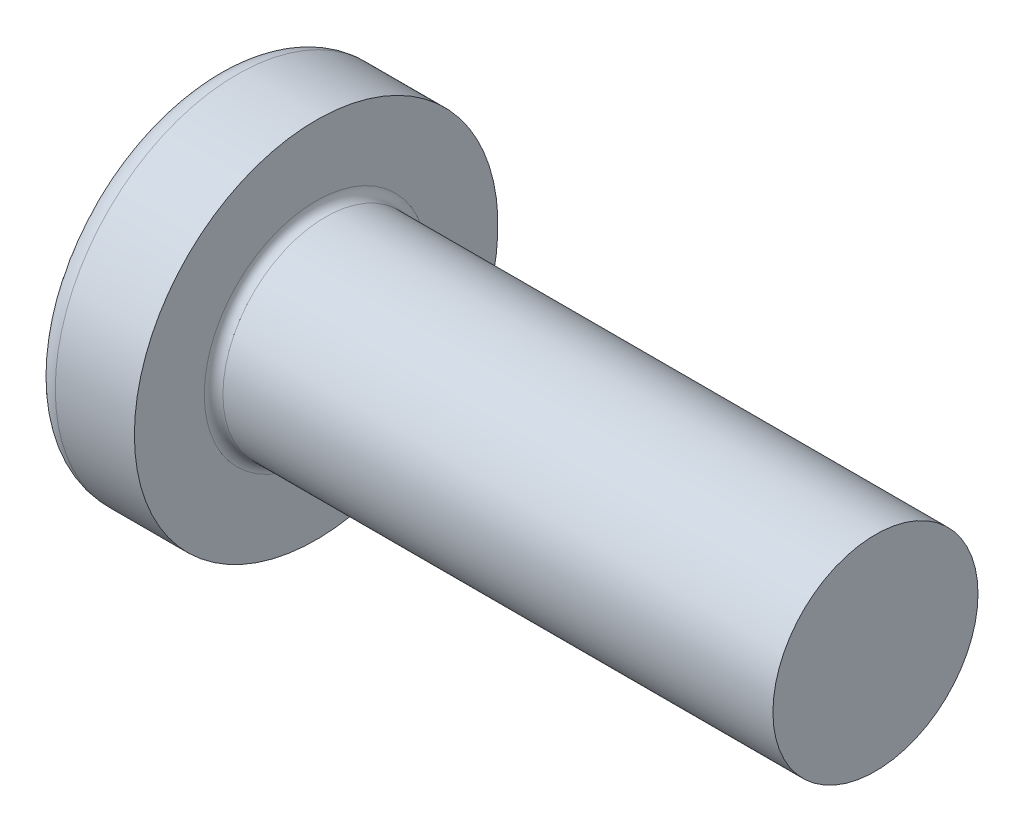
ISO-10303-21;
HEADER;
FILE_DESCRIPTION(('STEP AP214'),'2;1');
FILE_NAME('part.step','',(''),(''),'','','');
FILE_SCHEMA(('AUTOMOTIVE_DESIGN { 1 0 10303 214 1 1 1 1 }'));
ENDSEC;
DATA;
#1=APPLICATION_CONTEXT('core data for automotive mechanical design processes');
#2=APPLICATION_PROTOCOL_DEFINITION('international standard','automotive_design',2000,#1);
#3=PRODUCT_CONTEXT('',#1,'mechanical');
#4=PRODUCT('Part','Part','',(#3));
#5=PRODUCT_RELATED_PRODUCT_CATEGORY('part','',(#4));
#6=PRODUCT_DEFINITION_FORMATION('','',#4);
#7=PRODUCT_DEFINITION_CONTEXT('part definition',#1,'design');
#8=PRODUCT_DEFINITION('design','',#6,#7);
#9=PRODUCT_DEFINITION_SHAPE('','',#8);
#10=(LENGTH_UNIT() NAMED_UNIT(*) SI_UNIT(.MILLI.,.METRE.));
#11=(NAMED_UNIT(*) PLANE_ANGLE_UNIT() SI_UNIT($,.RADIAN.));
#12=(NAMED_UNIT(*) SI_UNIT($,.STERADIAN.) SOLID_ANGLE_UNIT());
#13=UNCERTAINTY_MEASURE_WITH_UNIT(LENGTH_MEASURE(1.E-05),#10,'distance_accuracy_value','');
#14=(GEOMETRIC_REPRESENTATION_CONTEXT(3) GLOBAL_UNCERTAINTY_ASSIGNED_CONTEXT((#13)) GLOBAL_UNIT_ASSIGNED_CONTEXT((#10,
#11,#12)) REPRESENTATION_CONTEXT('',''));
#15=CARTESIAN_POINT('',(0.,0.,0.));
#16=DIRECTION('',(0.,0.,1.));
#17=DIRECTION('',(1.,0.,0.));
#18=AXIS2_PLACEMENT_3D('',#15,#16,#17);
#19=CARTESIAN_POINT('',(1.20000000000017,0.601702090980205,-0.299999999999925));
#20=DIRECTION('',(-1.,0.,0.));
#21=DIRECTION('',(0.,0.,1.));
#22=AXIS2_PLACEMENT_3D('',#19,#20,#21);
#23=PLANE('',#22);
#24=DIRECTION('',(0.,0.,-1.));
#25=VECTOR('',#24,1.);
#26=CARTESIAN_POINT('',(1.20000000000006,0.299999999999995,0.601702090980281));
#27=LINE('',#26,#25);
#28=CARTESIAN_POINT('',(1.20000000000007,0.299999999999999,-0.601702090980158));
#29=VERTEX_POINT('',#28);
#30=CARTESIAN_POINT('',(1.19999999999322,0.300000000000223,-0.468119642828603));
#31=VERTEX_POINT('',#30);
#32=EDGE_CURVE('E269',#29,#31,#27,.F.);
#33=ORIENTED_EDGE('',*,*,#32,.F.);
#34=DIRECTION('',(0.,1.,0.));
#35=VECTOR('',#34,1.);
#36=CARTESIAN_POINT('',(1.20000000000009,0.30000000000005,-0.601702090980196));
#37=LINE('',#36,#35);
#38=CARTESIAN_POINT('',(1.20000000000006,-0.300000000000009,-0.601702090980197));
#39=VERTEX_POINT('',#38);
#40=EDGE_CURVE('E274',#29,#39,#37,.F.);
#41=ORIENTED_EDGE('',*,*,#40,.T.);
#42=DIRECTION('',(0.,0.,1.));
#43=VECTOR('',#42,1.);
#44=CARTESIAN_POINT('',(1.20000000000001,-0.300000000000009,-0.601702090980216));
#45=LINE('',#44,#43);
#46=CARTESIAN_POINT('',(1.19999999999315,-0.300000000000355,-0.468119642828791));
#47=VERTEX_POINT('',#46);
#48=EDGE_CURVE('E321',#47,#39,#45,.F.);
#49=ORIENTED_EDGE('',*,*,#48,.F.);
#50=CARTESIAN_POINT('',(1.20000000000331,0.,0.));
#51=DIRECTION('',(-1.,0.,0.));
#52=DIRECTION('',(0.,0.,1.));
#53=AXIS2_PLACEMENT_3D('',#50,#51,#52);
#54=CIRCLE('',#53,0.556000000001267);
#55=EDGE_CURVE('E543',#47,#31,#54,.F.);
#56=ORIENTED_EDGE('',*,*,#55,.T.);
#57=EDGE_LOOP('',(#33,#41,#49,#56));
#58=FACE_BOUND('',#57,.T.);
#59=ADVANCED_FACE('F16',(#58),#23,.T.);
#60=CARTESIAN_POINT('',(1.20000000000017,0.601702090980205,-0.299999999999925));
#61=DIRECTION('',(-1.,0.,0.));
#62=DIRECTION('',(0.,0.,1.));
#63=AXIS2_PLACEMENT_3D('',#60,#61,#62);
#64=PLANE('',#63);
#65=DIRECTION('',(0.,1.,0.));
#66=VECTOR('',#65,1.);
#67=CARTESIAN_POINT('',(1.20000000000015,-0.601702090980191,0.300000000000012));
#68=LINE('',#67,#66);
#69=CARTESIAN_POINT('',(1.20000000000015,0.601702090980177,0.300000000000012));
#70=VERTEX_POINT('',#69);
#71=CARTESIAN_POINT('',(1.19999999999322,0.468119642828662,0.30000000000026));
#72=VERTEX_POINT('',#71);
#73=EDGE_CURVE('E139',#70,#72,#68,.F.);
#74=ORIENTED_EDGE('',*,*,#73,.F.);
#75=DIRECTION('',(0.,0.,1.));
#76=VECTOR('',#75,1.);
#77=CARTESIAN_POINT('',(1.20000000000015,0.601702090980177,0.300000000000064));
#78=LINE('',#77,#76);
#79=CARTESIAN_POINT('',(1.20000000000014,0.601702090980178,-0.299999999999925));
#80=VERTEX_POINT('',#79);
#81=EDGE_CURVE('E262',#70,#80,#78,.F.);
#82=ORIENTED_EDGE('',*,*,#81,.T.);
#83=DIRECTION('',(0.,1.,0.));
#84=VECTOR('',#83,1.);
#85=CARTESIAN_POINT('',(1.20000000000013,0.601702090980205,-0.299999999999925));
#86=LINE('',#85,#84);
#87=CARTESIAN_POINT('',(1.19999999999322,0.46811964282867,-0.300000000000143));
#88=VERTEX_POINT('',#87);
#89=EDGE_CURVE('E142',#88,#80,#86,.T.);
#90=ORIENTED_EDGE('',*,*,#89,.F.);
#91=CARTESIAN_POINT('',(1.20000000000345,0.,0.));
#92=DIRECTION('',(-1.,0.,0.));
#93=DIRECTION('',(0.,0.,1.));
#94=AXIS2_PLACEMENT_3D('',#91,#92,#93);
#95=CIRCLE('',#94,0.556000000000823);
#96=EDGE_CURVE('E136',#88,#72,#95,.F.);
#97=ORIENTED_EDGE('',*,*,#96,.T.);
#98=EDGE_LOOP('',(#74,#82,#90,#97));
#99=FACE_BOUND('',#98,.T.);
#100=ADVANCED_FACE('F138',(#99),#64,.T.);
#101=CARTESIAN_POINT('',(1.20000000000017,0.601702090980205,-0.299999999999925));
#102=DIRECTION('',(-1.,0.,0.));
#103=DIRECTION('',(0.,0.,1.));
#104=AXIS2_PLACEMENT_3D('',#101,#102,#103);
#105=PLANE('',#104);
#106=DIRECTION('',(0.,0.,1.));
#107=VECTOR('',#106,1.);
#108=CARTESIAN_POINT('',(1.20000000000008,-0.300000000000009,-0.601702090980216));
#109=LINE('',#108,#107);
#110=CARTESIAN_POINT('',(1.20000000000008,-0.300000000000014,0.601702090980229));
#111=VERTEX_POINT('',#110);
#112=CARTESIAN_POINT('',(1.19999999999322,-0.300000000000252,0.468119642828697));
#113=VERTEX_POINT('',#112);
#114=EDGE_CURVE('E250',#111,#113,#109,.F.);
#115=ORIENTED_EDGE('',*,*,#114,.F.);
#116=DIRECTION('',(0.,1.,0.));
#117=VECTOR('',#116,1.);
#118=CARTESIAN_POINT('',(1.20000000000008,-0.30000000000005,0.601702090980229));
#119=LINE('',#118,#117);
#120=CARTESIAN_POINT('',(1.20000000000009,0.299999999999995,0.601702090980231));
#121=VERTEX_POINT('',#120);
#122=EDGE_CURVE('E255',#111,#121,#119,.T.);
#123=ORIENTED_EDGE('',*,*,#122,.T.);
#124=DIRECTION('',(0.,0.,-1.));
#125=VECTOR('',#124,1.);
#126=CARTESIAN_POINT('',(1.20000000000012,0.299999999999995,0.601702090980281));
#127=LINE('',#126,#125);
#128=CARTESIAN_POINT('',(1.19999999999315,0.300000000000337,0.468119642828898));
#129=VERTEX_POINT('',#128);
#130=EDGE_CURVE('E299',#129,#121,#127,.F.);
#131=ORIENTED_EDGE('',*,*,#130,.F.);
#132=CARTESIAN_POINT('',(1.20000000000345,0.,0.));
#133=DIRECTION('',(-1.,0.,0.));
#134=DIRECTION('',(0.,0.,1.));
#135=AXIS2_PLACEMENT_3D('',#132,#133,#134);
#136=CIRCLE('',#135,0.556000000000823);
#137=EDGE_CURVE('E148',#129,#113,#136,.F.);
#138=ORIENTED_EDGE('',*,*,#137,.T.);
#139=EDGE_LOOP('',(#115,#123,#131,#138));
#140=FACE_BOUND('',#139,.T.);
#141=ADVANCED_FACE('F558',(#140),#105,.T.);
#142=CARTESIAN_POINT('',(1.20000000000331,0.,0.));
#143=DIRECTION('',(-1.,0.,0.));
#144=DIRECTION('',(0.,0.,1.));
#145=AXIS2_PLACEMENT_3D('',#142,#143,#144);
#146=CONICAL_SURFACE('',#145,0.556000000001267,1.25663706143507);
#147=CARTESIAN_POINT('',(1.38065535110907,0.,-1.11022302462516E-12));
#148=VERTEX_POINT('',#147);
#149=VERTEX_LOOP('',#148);
#150=FACE_BOUND('',#149,.T.);
#151=CARTESIAN_POINT('',(1.19999999998299,0.,0.));
#152=DIRECTION('',(-1.,0.,0.));
#153=DIRECTION('',(0.,0.,1.));
#154=AXIS2_PLACEMENT_3D('',#151,#152,#153);
#155=CIRCLE('',#154,0.556000000003071);
#156=EDGE_CURVE('E268',#88,#31,#155,.T.);
#157=ORIENTED_EDGE('',*,*,#156,.T.);
#158=ORIENTED_EDGE('',*,*,#55,.F.);
#159=CARTESIAN_POINT('',(1.19999999998299,0.,0.));
#160=DIRECTION('',(-1.,0.,0.));
#161=DIRECTION('',(0.,0.,1.));
#162=AXIS2_PLACEMENT_3D('',#159,#160,#161);
#163=CIRCLE('',#162,0.556000000003071);
#164=CARTESIAN_POINT('',(1.19999999999322,-0.468119642828657,-0.300000000000186));
#165=VERTEX_POINT('',#164);
#166=EDGE_CURVE('E329',#47,#165,#163,.T.);
#167=ORIENTED_EDGE('',*,*,#166,.T.);
#168=CARTESIAN_POINT('',(1.20000000000345,0.,0.));
#169=DIRECTION('',(-1.,0.,0.));
#170=DIRECTION('',(0.,0.,1.));
#171=AXIS2_PLACEMENT_3D('',#168,#169,#170);
#172=CIRCLE('',#171,0.556000000000824);
#173=CARTESIAN_POINT('',(1.19999999999322,-0.468119642828679,0.300000000000255));
#174=VERTEX_POINT('',#173);
#175=EDGE_CURVE('E289',#174,#165,#172,.F.);
#176=ORIENTED_EDGE('',*,*,#175,.F.);
#177=CARTESIAN_POINT('',(1.19999999998299,0.,0.));
#178=DIRECTION('',(-1.,0.,0.));
#179=DIRECTION('',(0.,0.,1.));
#180=AXIS2_PLACEMENT_3D('',#177,#178,#179);
#181=CIRCLE('',#180,0.556000000003071);
#182=EDGE_CURVE('E249',#174,#113,#181,.T.);
#183=ORIENTED_EDGE('',*,*,#182,.T.);
#184=ORIENTED_EDGE('',*,*,#137,.F.);
#185=CARTESIAN_POINT('',(1.19999999998299,0.,0.));
#186=DIRECTION('',(-1.,0.,0.));
#187=DIRECTION('',(0.,0.,1.));
#188=AXIS2_PLACEMENT_3D('',#185,#186,#187);
#189=CIRCLE('',#188,0.556000000003071);
#190=EDGE_CURVE('E161',#129,#72,#189,.T.);
#191=ORIENTED_EDGE('',*,*,#190,.T.);
#192=ORIENTED_EDGE('',*,*,#96,.F.);
#193=EDGE_LOOP('',(#157,#158,#167,#176,#183,#184,#191,#192));
#194=FACE_BOUND('',#193,.T.);
#195=ADVANCED_FACE('F162',(#150,#194),#146,.F.);
#196=CARTESIAN_POINT('',(1.20000000000017,0.601702090980205,-0.299999999999925));
#197=DIRECTION('',(-1.,0.,0.));
#198=DIRECTION('',(0.,0.,1.));
#199=AXIS2_PLACEMENT_3D('',#196,#197,#198);
#200=PLANE('',#199);
#201=DIRECTION('',(0.,1.,0.));
#202=VECTOR('',#201,1.);
#203=CARTESIAN_POINT('',(1.20000000000017,0.601702090980205,-0.299999999999925));
#204=LINE('',#203,#202);
#205=CARTESIAN_POINT('',(1.20000000000018,-0.601702090980224,-0.299999999999974));
#206=VERTEX_POINT('',#205);
#207=EDGE_CURVE('E285',#206,#165,#204,.T.);
#208=ORIENTED_EDGE('',*,*,#207,.F.);
#209=DIRECTION('',(0.,0.,1.));
#210=VECTOR('',#209,1.);
#211=CARTESIAN_POINT('',(1.20000000000019,-0.601702090980234,-0.300000000000002));
#212=LINE('',#211,#210);
#213=CARTESIAN_POINT('',(1.20000000000015,-0.601702090980233,0.300000000000012));
#214=VERTEX_POINT('',#213);
#215=EDGE_CURVE('E237',#206,#214,#212,.T.);
#216=ORIENTED_EDGE('',*,*,#215,.T.);
#217=DIRECTION('',(0.,1.,0.));
#218=VECTOR('',#217,1.);
#219=CARTESIAN_POINT('',(1.20000000000006,-0.601702090980191,0.300000000000012));
#220=LINE('',#219,#218);
#221=EDGE_CURVE('E243',#174,#214,#220,.F.);
#222=ORIENTED_EDGE('',*,*,#221,.F.);
#223=ORIENTED_EDGE('',*,*,#175,.T.);
#224=EDGE_LOOP('',(#208,#216,#222,#223));
#225=FACE_BOUND('',#224,.T.);
#226=ADVANCED_FACE('F547',(#225),#200,.T.);
#227=CARTESIAN_POINT('',(1.20000000000017,0.601702090980205,-0.299999999999925));
#228=DIRECTION('',(0.,0.,1.));
#229=DIRECTION('',(1.,0.,0.));
#230=AXIS2_PLACEMENT_3D('',#227,#228,#229);
#231=PLANE('',#230);
#232=CARTESIAN_POINT('',(0.170303564593952,-1.11508977783741,-0.299999999999926));
#233=CARTESIAN_POINT('',(0.143844871789577,-1.02418894622965,-0.299999999999926));
#234=CARTESIAN_POINT('',(0.12066873211864,-0.932580739405482,-0.299999999999927));
#235=CARTESIAN_POINT('',(0.080881559043638,-0.747949575324328,-0.299999999999926));
#236=CARTESIAN_POINT('',(0.0642705256395739,-0.654926618067341,-0.299999999999925));
#237=CARTESIAN_POINT('',(0.0509420453689467,-0.561196285593944,-0.299999999999923));
#238=B_SPLINE_CURVE_WITH_KNOTS('',3,(#232,#233,#234,#235,#236,#237),.UNSPECIFIED.,.F.,.F.,(4,2,
4),(0.,0.283483285341968,0.566966570683936),.UNSPECIFIED.);
#239=CARTESIAN_POINT('',(0.170303564593989,-1.11508977783742,-0.299999999999962));
#240=VERTEX_POINT('',#239);
#241=CARTESIAN_POINT('',(0.0509420453853583,-0.561196285591637,-0.299999999999926));
#242=VERTEX_POINT('',#241);
#243=EDGE_CURVE('E236',#240,#242,#238,.T.);
#244=ORIENTED_EDGE('',*,*,#243,.F.);
#245=DIRECTION('',(0.89493436774996,0.446197800778958,0.));
#246=VECTOR('',#245,1.);
#247=CARTESIAN_POINT('',(1.66533453693773E-13,-1.20000000000003,-0.299999999999998));
#248=LINE('',#247,#246);
#249=EDGE_CURVE('E240',#240,#206,#248,.T.);
#250=ORIENTED_EDGE('',*,*,#249,.T.);
#251=ORIENTED_EDGE('',*,*,#207,.T.);
#252=CARTESIAN_POINT('',(1.19999999999203,-0.468119642826695,-0.299999999999925));
#253=CARTESIAN_POINT('',(1.00851907507706,-0.4839872862128,-0.299999999999925));
#254=CARTESIAN_POINT('',(0.817023777523879,-0.49967749524178,-0.299999999999925));
#255=CARTESIAN_POINT('',(0.43400445931648,-0.530703042789225,-0.299999999999926));
#256=CARTESIAN_POINT('',(0.242480438665591,-0.546038381348781,-0.299999999999926));
#257=CARTESIAN_POINT('',(0.0509420453798227,-0.561196285592303,-0.299999999999926));
#258=B_SPLINE_CURVE_WITH_KNOTS('',3,(#252,#253,#254,#255,#256,#257),.UNSPECIFIED.,.F.,.F.,(4,2,
4),(0.,0.576411038061547,1.15282200937903),.UNSPECIFIED.);
#259=EDGE_CURVE('E288',#165,#242,#258,.T.);
#260=ORIENTED_EDGE('',*,*,#259,.T.);
#261=EDGE_LOOP('',(#244,#250,#251,#260));
#262=FACE_BOUND('',#261,.T.);
#263=ADVANCED_FACE('F469',(#262),#231,.T.);
#264=CARTESIAN_POINT('',(0.0509420455614424,0.,0.));
#265=DIRECTION('',(-1.,0.,0.));
#266=DIRECTION('',(0.,0.,1.));
#267=AXIS2_PLACEMENT_3D('',#264,#265,#266);
#268=CONICAL_SURFACE('',#267,0.63634995949254,0.0698131700804004);
#269=CARTESIAN_POINT('',(0.0509420453724411,-0.300000000000009,-0.5611962855926));
#270=CARTESIAN_POINT('',(0.242480438660381,-0.300000000000009,-0.546038381348952));
#271=CARTESIAN_POINT('',(0.434004459313444,-0.300000000000009,-0.530703042789298));
#272=CARTESIAN_POINT('',(0.817023777525195,-0.300000000000009,-0.499677495241717));
#273=CARTESIAN_POINT('',(1.00851907508055,-0.300000000000009,-0.483987286212698));
#274=CARTESIAN_POINT('',(1.19999999999771,-0.300000000000009,-0.468119642826583));
#275=B_SPLINE_CURVE_WITH_KNOTS('',3,(#269,#270,#271,#272,#273,#274),.UNSPECIFIED.,.F.,.F.,(4,2,
4),(0.,0.576410971324008,1.15282200939208),.UNSPECIFIED.);
#276=CARTESIAN_POINT('',(0.0509420453816771,-0.300000000000009,-0.561196285631203));
#277=VERTEX_POINT('',#276);
#278=EDGE_CURVE('E326',#277,#47,#275,.T.);
#279=ORIENTED_EDGE('',*,*,#278,.F.);
#280=CARTESIAN_POINT('',(0.0509420453909121,0.,0.));
#281=DIRECTION('',(-1.,0.,0.));
#282=DIRECTION('',(0.,0.,1.));
#283=AXIS2_PLACEMENT_3D('',#280,#281,#282);
#284=CIRCLE('',#283,0.636349959504464);
#285=EDGE_CURVE('E461',#242,#277,#284,.F.);
#286=ORIENTED_EDGE('',*,*,#285,.F.);
#287=ORIENTED_EDGE('',*,*,#259,.F.);
#288=ORIENTED_EDGE('',*,*,#166,.F.);
#289=EDGE_LOOP('',(#279,#286,#287,#288));
#290=FACE_BOUND('',#289,.T.);
#291=ADVANCED_FACE('F442',(#290),#268,.F.);
#292=CARTESIAN_POINT('',(1.20000000000005,-0.300000000000009,-0.601702090980216));
#293=DIRECTION('',(0.,1.,0.));
#294=DIRECTION('',(0.,0.,1.));
#295=AXIS2_PLACEMENT_3D('',#292,#293,#294);
#296=PLANE('',#295);
#297=ORIENTED_EDGE('',*,*,#48,.T.);
#298=DIRECTION('',(-0.894934367749961,0.,-0.446197800778958));
#299=VECTOR('',#298,1.);
#300=CARTESIAN_POINT('',(1.11854539303412E-13,-0.300000000000009,-1.19999999999998));
#301=LINE('',#300,#299);
#302=CARTESIAN_POINT('',(0.170303564593943,-0.30000000000003,-1.11508977783739));
#303=VERTEX_POINT('',#302);
#304=EDGE_CURVE('E272',#39,#303,#301,.T.);
#305=ORIENTED_EDGE('',*,*,#304,.T.);
#306=CARTESIAN_POINT('',(4.0000000000001,-0.300000000000011,0.));
#307=DIRECTION('',(0.,1.,0.));
#308=DIRECTION('',(-1.,0.,0.));
#309=AXIS2_PLACEMENT_3D('',#306,#307,#308);
#310=CIRCLE('',#309,3.98873413503583);
#311=EDGE_CURVE('E459',#277,#303,#310,.F.);
#312=ORIENTED_EDGE('',*,*,#311,.F.);
#313=ORIENTED_EDGE('',*,*,#278,.T.);
#314=EDGE_LOOP('',(#297,#305,#312,#313));
#315=FACE_BOUND('',#314,.T.);
#316=ADVANCED_FACE('F444',(#315),#296,.T.);
#317=CARTESIAN_POINT('',(1.11022302462516E-13,0.30000000000005,-1.19999999999998));
#318=DIRECTION('',(0.446197800778958,0.,-0.894934367749961));
#319=DIRECTION('',(-0.894934367749961,0.,-0.446197800778958));
#320=AXIS2_PLACEMENT_3D('',#317,#318,#319);
#321=PLANE('',#320);
#322=ORIENTED_EDGE('',*,*,#40,.F.);
#323=DIRECTION('',(0.894934367749936,0.,0.446197800779006));
#324=VECTOR('',#323,1.);
#325=CARTESIAN_POINT('',(0.170303564593938,0.300000000000001,-1.11508977783739));
#326=LINE('',#325,#324);
#327=CARTESIAN_POINT('',(0.170303564593944,0.300000000000003,-1.11508977783738));
#328=VERTEX_POINT('',#327);
#329=EDGE_CURVE('E265',#328,#29,#326,.T.);
#330=ORIENTED_EDGE('',*,*,#329,.F.);
#331=CARTESIAN_POINT('',(0.170303564593953,-0.300000000000028,-1.11508977783738));
#332=CARTESIAN_POINT('',(0.163473050626786,-0.200000000000026,-1.11849534635745));
#333=CARTESIAN_POINT('',(0.160057793643203,-0.100000000000023,-1.12019813061749));
#334=CARTESIAN_POINT('',(0.160057793643202,0.0999999999999826,-1.12019813061749));
#335=CARTESIAN_POINT('',(0.163473050626785,0.199999999999985,-1.11849534635745));
#336=CARTESIAN_POINT('',(0.170303564593951,0.299999999999988,-1.11508977783738));
#337=B_SPLINE_CURVE_WITH_KNOTS('',3,(#331,#332,#333,#334,#335,#336),.UNSPECIFIED.,.F.,.F.,(4,2,
4),(0.,0.300218372340045,0.600436744680091),.UNSPECIFIED.);
#338=EDGE_CURVE('E453',#303,#328,#337,.T.);
#339=ORIENTED_EDGE('',*,*,#338,.F.);
#340=ORIENTED_EDGE('',*,*,#304,.F.);
#341=EDGE_LOOP('',(#322,#330,#339,#340));
#342=FACE_BOUND('',#341,.T.);
#343=ADVANCED_FACE('F447',(#342),#321,.F.);
#344=CARTESIAN_POINT('',(1.20000000000015,0.299999999999995,0.601702090980281));
#345=DIRECTION('',(0.,-1.,0.));
#346=DIRECTION('',(0.,0.,-1.));
#347=AXIS2_PLACEMENT_3D('',#344,#345,#346);
#348=PLANE('',#347);
#349=CARTESIAN_POINT('',(4.0000000000001,0.3,0.));
#350=DIRECTION('',(0.,1.,0.));
#351=DIRECTION('',(-1.,0.,0.));
#352=AXIS2_PLACEMENT_3D('',#349,#350,#351);
#353=CIRCLE('',#352,3.98873413503583);
#354=CARTESIAN_POINT('',(0.050942045385345,0.3,-0.561196285630917));
#355=VERTEX_POINT('',#354);
#356=EDGE_CURVE('E407',#328,#355,#353,.T.);
#357=ORIENTED_EDGE('',*,*,#356,.F.);
#358=ORIENTED_EDGE('',*,*,#329,.T.);
#359=ORIENTED_EDGE('',*,*,#32,.T.);
#360=CARTESIAN_POINT('',(1.19999999999199,0.299999999999999,-0.468119642826637));
#361=CARTESIAN_POINT('',(1.00851907507702,0.299999999999999,-0.483987286212743));
#362=CARTESIAN_POINT('',(0.817023777523844,0.299999999999999,-0.499677495241723));
#363=CARTESIAN_POINT('',(0.43400445931645,0.299999999999999,-0.530703042789169));
#364=CARTESIAN_POINT('',(0.242480438665563,0.299999999999999,-0.546038381348726));
#365=CARTESIAN_POINT('',(0.050942045379796,0.299999999999999,-0.561196285592249));
#366=B_SPLINE_CURVE_WITH_KNOTS('',3,(#360,#361,#362,#363,#364,#365),.UNSPECIFIED.,.F.,.F.,(4,2,
4),(0.,0.576411038061541,1.15282200937902),.UNSPECIFIED.);
#367=EDGE_CURVE('E315',#31,#355,#366,.T.);
#368=ORIENTED_EDGE('',*,*,#367,.T.);
#369=EDGE_LOOP('',(#357,#358,#359,#368));
#370=FACE_BOUND('',#369,.T.);
#371=ADVANCED_FACE('F422',(#370),#348,.T.);
#372=CARTESIAN_POINT('',(0.0509420455614424,0.,0.));
#373=DIRECTION('',(-1.,0.,0.));
#374=DIRECTION('',(0.,0.,1.));
#375=AXIS2_PLACEMENT_3D('',#372,#373,#374);
#376=CONICAL_SURFACE('',#375,0.63634995949254,0.0698131700804004);
#377=ORIENTED_EDGE('',*,*,#367,.F.);
#378=ORIENTED_EDGE('',*,*,#156,.F.);
#379=CARTESIAN_POINT('',(0.0509420453725142,0.561196285592655,-0.299999999999927));
#380=CARTESIAN_POINT('',(0.242480438660458,0.546038381349008,-0.299999999999926));
#381=CARTESIAN_POINT('',(0.434004459313524,0.530703042789355,-0.299999999999926));
#382=CARTESIAN_POINT('',(0.817023777525282,0.499677495241775,-0.299999999999926));
#383=CARTESIAN_POINT('',(1.00851907508065,0.483987286212757,-0.299999999999925));
#384=CARTESIAN_POINT('',(1.1999999999978,0.468119642826642,-0.299999999999925));
#385=B_SPLINE_CURVE_WITH_KNOTS('',3,(#379,#380,#381,#382,#383,#384),.UNSPECIFIED.,.F.,.F.,(4,2,
4),(0.,0.576410971324019,1.1528220093921),.UNSPECIFIED.);
#386=CARTESIAN_POINT('',(0.0509420453706602,0.561196285592808,-0.299999999999926));
#387=VERTEX_POINT('',#386);
#388=EDGE_CURVE('E186',#387,#88,#385,.T.);
#389=ORIENTED_EDGE('',*,*,#388,.F.);
#390=CARTESIAN_POINT('',(0.0509420453909121,0.,0.));
#391=DIRECTION('',(-1.,0.,0.));
#392=DIRECTION('',(0.,0.,1.));
#393=AXIS2_PLACEMENT_3D('',#390,#391,#392);
#394=CIRCLE('',#393,0.636349959504464);
#395=EDGE_CURVE('E406',#355,#387,#394,.F.);
#396=ORIENTED_EDGE('',*,*,#395,.F.);
#397=EDGE_LOOP('',(#377,#378,#389,#396));
#398=FACE_BOUND('',#397,.T.);
#399=ADVANCED_FACE('F416',(#398),#376,.F.);
#400=CARTESIAN_POINT('',(1.20000000000017,0.601702090980205,-0.299999999999925));
#401=DIRECTION('',(0.,0.,1.));
#402=DIRECTION('',(1.,0.,0.));
#403=AXIS2_PLACEMENT_3D('',#400,#401,#402);
#404=PLANE('',#403);
#405=ORIENTED_EDGE('',*,*,#89,.T.);
#406=DIRECTION('',(-0.89493436774996,0.446197800778958,0.));
#407=VECTOR('',#406,1.);
#408=CARTESIAN_POINT('',(1.20000000000015,0.601702090980178,-0.299999999999925));
#409=LINE('',#408,#407);
#410=CARTESIAN_POINT('',(0.170303564593957,1.11508977783739,-0.299999999999948));
#411=VERTEX_POINT('',#410);
#412=EDGE_CURVE('E158',#80,#411,#409,.T.);
#413=ORIENTED_EDGE('',*,*,#412,.T.);
#414=CARTESIAN_POINT('',(0.0509420453688062,0.561196285592961,-0.299999999999926));
#415=CARTESIAN_POINT('',(0.0642705256394337,0.654926618066525,-0.299999999999926));
#416=CARTESIAN_POINT('',(0.0808815590435093,0.747949575323677,-0.299999999999926));
#417=CARTESIAN_POINT('',(0.120668732118557,0.932580739405156,-0.299999999999927));
#418=CARTESIAN_POINT('',(0.143844871789528,1.02418894622948,-0.299999999999928));
#419=CARTESIAN_POINT('',(0.170303564593948,1.1150897778374,-0.299999999999929));
#420=B_SPLINE_CURVE_WITH_KNOTS('',3,(#414,#415,#416,#417,#418,#419),.UNSPECIFIED.,.F.,.F.,(4,2,
4),(0.,0.28348328534246,0.56696657068492),.UNSPECIFIED.);
#421=EDGE_CURVE('E403',#387,#411,#420,.T.);
#422=ORIENTED_EDGE('',*,*,#421,.F.);
#423=ORIENTED_EDGE('',*,*,#388,.T.);
#424=EDGE_LOOP('',(#405,#413,#422,#423));
#425=FACE_BOUND('',#424,.T.);
#426=ADVANCED_FACE('F413',(#425),#404,.T.);
#427=CARTESIAN_POINT('',(1.20000000000015,0.601702090980177,0.300000000000064));
#428=DIRECTION('',(0.446197800778958,0.89493436774996,0.));
#429=DIRECTION('',(-0.89493436774996,0.446197800778958,0.));
#430=AXIS2_PLACEMENT_3D('',#427,#428,#429);
#431=PLANE('',#430);
#432=ORIENTED_EDGE('',*,*,#81,.F.);
#433=DIRECTION('',(0.894934367749958,-0.446197800778962,0.));
#434=VECTOR('',#433,1.);
#435=CARTESIAN_POINT('',(0.170303564594021,1.11508977783736,0.300000000000011));
#436=LINE('',#435,#434);
#437=CARTESIAN_POINT('',(0.170303564593986,1.11508977783737,0.30000000000001));
#438=VERTEX_POINT('',#437);
#439=EDGE_CURVE('E157',#438,#70,#436,.T.);
#440=ORIENTED_EDGE('',*,*,#439,.F.);
#441=CARTESIAN_POINT('',(0.17030356459395,1.11508977783739,-0.299999999999946));
#442=CARTESIAN_POINT('',(0.163473050626786,1.11849534635746,-0.199999999999964));
#443=CARTESIAN_POINT('',(0.160057793643205,1.1201981306175,-0.0999999999999826));
#444=CARTESIAN_POINT('',(0.160057793643207,1.1201981306175,0.100000000000025));
#445=CARTESIAN_POINT('',(0.163473050626793,1.11849534635747,0.200000000000052));
#446=CARTESIAN_POINT('',(0.170303564593965,1.11508977783741,0.300000000000078));
#447=B_SPLINE_CURVE_WITH_KNOTS('',3,(#441,#442,#443,#444,#445,#446),.UNSPECIFIED.,.F.,.F.,(4,2,
4),(0.,0.300218372339983,0.600436744680098),.UNSPECIFIED.);
#448=EDGE_CURVE('E208',#411,#438,#447,.T.);
#449=ORIENTED_EDGE('',*,*,#448,.F.);
#450=ORIENTED_EDGE('',*,*,#412,.F.);
#451=EDGE_LOOP('',(#432,#440,#449,#450));
#452=FACE_BOUND('',#451,.T.);
#453=ADVANCED_FACE('F197',(#452),#431,.F.);
#454=CARTESIAN_POINT('',(1.20000000000008,-0.601702090980191,0.300000000000012));
#455=DIRECTION('',(0.,0.,-1.));
#456=DIRECTION('',(-1.,0.,0.));
#457=AXIS2_PLACEMENT_3D('',#454,#455,#456);
#458=PLANE('',#457);
#459=CARTESIAN_POINT('',(0.170303564593951,1.11508977783738,0.30000000000001));
#460=CARTESIAN_POINT('',(0.143844871789576,1.02418894622962,0.300000000000011));
#461=CARTESIAN_POINT('',(0.120668732118638,0.932580739405457,0.300000000000011));
#462=CARTESIAN_POINT('',(0.0808815590436373,0.7479495753243,0.30000000000001));
#463=CARTESIAN_POINT('',(0.064270525639574,0.654926618067312,0.300000000000009));
#464=CARTESIAN_POINT('',(0.0509420453689479,0.561196285593914,0.300000000000007));
#465=B_SPLINE_CURVE_WITH_KNOTS('',3,(#459,#460,#461,#462,#463,#464),.UNSPECIFIED.,.F.,.F.,(4,2,
4),(0.,0.283483285341971,0.566966570683942),.UNSPECIFIED.);
#466=CARTESIAN_POINT('',(0.050942045385351,0.561196285591632,0.300000000000011));
#467=VERTEX_POINT('',#466);
#468=EDGE_CURVE('E201',#438,#467,#465,.T.);
#469=ORIENTED_EDGE('',*,*,#468,.F.);
#470=ORIENTED_EDGE('',*,*,#439,.T.);
#471=ORIENTED_EDGE('',*,*,#73,.T.);
#472=CARTESIAN_POINT('',(1.19999999999203,0.468119642826689,0.300000000000012));
#473=CARTESIAN_POINT('',(1.00851907507705,0.483987286212794,0.300000000000012));
#474=CARTESIAN_POINT('',(0.81702377752387,0.499677495241774,0.300000000000012));
#475=CARTESIAN_POINT('',(0.434004459316469,0.530703042789219,0.300000000000011));
#476=CARTESIAN_POINT('',(0.242480438665579,0.546038381348776,0.300000000000011));
#477=CARTESIAN_POINT('',(0.050942045379809,0.561196285592298,0.300000000000011));
#478=B_SPLINE_CURVE_WITH_KNOTS('',3,(#472,#473,#474,#475,#476,#477),.UNSPECIFIED.,.F.,.F.,(4,2,
4),(0.,0.57641103806155,1.15282200937904),.UNSPECIFIED.);
#479=EDGE_CURVE('E155',#72,#467,#478,.T.);
#480=ORIENTED_EDGE('',*,*,#479,.T.);
#481=EDGE_LOOP('',(#469,#470,#471,#480));
#482=FACE_BOUND('',#481,.T.);
#483=ADVANCED_FACE('F153',(#482),#458,.T.);
#484=CARTESIAN_POINT('',(0.0509420455614424,0.,0.));
#485=DIRECTION('',(-1.,0.,0.));
#486=DIRECTION('',(0.,0.,1.));
#487=AXIS2_PLACEMENT_3D('',#484,#485,#486);
#488=CONICAL_SURFACE('',#487,0.63634995949254,0.0698131700804004);
#489=CARTESIAN_POINT('',(0.0509420453724887,0.299999999999995,0.561196285592677));
#490=CARTESIAN_POINT('',(0.24248043866043,0.299999999999995,0.54603838134903));
#491=CARTESIAN_POINT('',(0.434004459313493,0.299999999999995,0.530703042789377));
#492=CARTESIAN_POINT('',(0.817023777525246,0.299999999999995,0.499677495241796));
#493=CARTESIAN_POINT('',(1.00851907508061,0.299999999999995,0.483987286212778));
#494=CARTESIAN_POINT('',(1.19999999999776,0.299999999999995,0.468119642826663));
#495=B_SPLINE_CURVE_WITH_KNOTS('',3,(#489,#490,#491,#492,#493,#494),.UNSPECIFIED.,.F.,.F.,(4,2,
4),(0.,0.576410971324011,1.15282200939208),.UNSPECIFIED.);
#496=CARTESIAN_POINT('',(0.0509420453817001,0.299999999999995,0.561196285631264));
#497=VERTEX_POINT('',#496);
#498=EDGE_CURVE('E166',#497,#129,#495,.T.);
#499=ORIENTED_EDGE('',*,*,#498,.F.);
#500=CARTESIAN_POINT('',(0.0509420453909121,0.,0.));
#501=DIRECTION('',(-1.,0.,0.));
#502=DIRECTION('',(0.,0.,1.));
#503=AXIS2_PLACEMENT_3D('',#500,#501,#502);
#504=CIRCLE('',#503,0.636349959504464);
#505=EDGE_CURVE('E170',#467,#497,#504,.F.);
#506=ORIENTED_EDGE('',*,*,#505,.F.);
#507=ORIENTED_EDGE('',*,*,#479,.F.);
#508=ORIENTED_EDGE('',*,*,#190,.F.);
#509=EDGE_LOOP('',(#499,#506,#507,#508));
#510=FACE_BOUND('',#509,.T.);
#511=ADVANCED_FACE('F168',(#510),#488,.F.);
#512=CARTESIAN_POINT('',(1.20000000000015,0.299999999999995,0.601702090980281));
#513=DIRECTION('',(0.,-1.,0.));
#514=DIRECTION('',(0.,0.,-1.));
#515=AXIS2_PLACEMENT_3D('',#512,#513,#514);
#516=PLANE('',#515);
#517=ORIENTED_EDGE('',*,*,#130,.T.);
#518=DIRECTION('',(0.894934367749961,0.,-0.446197800778956));
#519=VECTOR('',#518,1.);
#520=CARTESIAN_POINT('',(1.20000000000008,0.299999999999995,0.601702090980231));
#521=LINE('',#520,#519);
#522=CARTESIAN_POINT('',(0.170303564593947,0.299999999999998,1.11508977783741));
#523=VERTEX_POINT('',#522);
#524=EDGE_CURVE('E253',#121,#523,#521,.F.);
#525=ORIENTED_EDGE('',*,*,#524,.T.);
#526=CARTESIAN_POINT('',(4.0000000000001,0.299999999999993,0.));
#527=DIRECTION('',(0.,1.,0.));
#528=DIRECTION('',(-1.,0.,0.));
#529=AXIS2_PLACEMENT_3D('',#526,#527,#528);
#530=CIRCLE('',#529,3.98873413503583);
#531=EDGE_CURVE('E395',#497,#523,#530,.T.);
#532=ORIENTED_EDGE('',*,*,#531,.F.);
#533=ORIENTED_EDGE('',*,*,#498,.T.);
#534=EDGE_LOOP('',(#517,#525,#532,#533));
#535=FACE_BOUND('',#534,.T.);
#536=ADVANCED_FACE('F386',(#535),#516,.T.);
#537=CARTESIAN_POINT('',(1.20000000000008,-0.30000000000005,0.601702090980229));
#538=DIRECTION('',(0.446197800778956,0.,0.894934367749961));
#539=DIRECTION('',(0.894934367749961,0.,-0.446197800778956));
#540=AXIS2_PLACEMENT_3D('',#537,#538,#539);
#541=PLANE('',#540);
#542=ORIENTED_EDGE('',*,*,#122,.F.);
#543=DIRECTION('',(0.894934367749962,0.,-0.446197800778955));
#544=VECTOR('',#543,1.);
#545=CARTESIAN_POINT('',(0.170303564593965,-0.300000000000016,1.1150897778374));
#546=LINE('',#545,#544);
#547=CARTESIAN_POINT('',(0.17030356459396,-0.300000000000021,1.1150897778374));
#548=VERTEX_POINT('',#547);
#549=EDGE_CURVE('E246',#548,#111,#546,.T.);
#550=ORIENTED_EDGE('',*,*,#549,.F.);
#551=CARTESIAN_POINT('',(0.170303564593956,0.300000000000002,1.11508977783741));
#552=CARTESIAN_POINT('',(0.16347305062679,0.200000000000002,1.11849534635748));
#553=CARTESIAN_POINT('',(0.160057793643207,0.100000000000003,1.12019813061751));
#554=CARTESIAN_POINT('',(0.160057793643208,-0.0999999999999965,1.12019813061751));
#555=CARTESIAN_POINT('',(0.16347305062679,-0.199999999999996,1.11849534635748));
#556=CARTESIAN_POINT('',(0.170303564593956,-0.299999999999996,1.11508977783741));
#557=B_SPLINE_CURVE_WITH_KNOTS('',3,(#551,#552,#553,#554,#555,#556),.UNSPECIFIED.,.F.,.F.,(4,2,
4),(0.,0.300218372340036,0.600436744680072),.UNSPECIFIED.);
#558=EDGE_CURVE('E389',#523,#548,#557,.T.);
#559=ORIENTED_EDGE('',*,*,#558,.F.);
#560=ORIENTED_EDGE('',*,*,#524,.F.);
#561=EDGE_LOOP('',(#542,#550,#559,#560));
#562=FACE_BOUND('',#561,.T.);
#563=ADVANCED_FACE('F382',(#562),#541,.F.);
#564=CARTESIAN_POINT('',(1.20000000000005,-0.300000000000009,-0.601702090980216));
#565=DIRECTION('',(0.,1.,0.));
#566=DIRECTION('',(0.,0.,1.));
#567=AXIS2_PLACEMENT_3D('',#564,#565,#566);
#568=PLANE('',#567);
#569=CARTESIAN_POINT('',(4.0000000000001,-0.300000000000018,0.));
#570=DIRECTION('',(0.,1.,0.));
#571=DIRECTION('',(-1.,0.,0.));
#572=AXIS2_PLACEMENT_3D('',#569,#570,#571);
#573=CIRCLE('',#572,3.98873413503583);
#574=CARTESIAN_POINT('',(0.0509420453853438,-0.300000000000015,0.561196285630966));
#575=VERTEX_POINT('',#574);
#576=EDGE_CURVE('E394',#548,#575,#573,.F.);
#577=ORIENTED_EDGE('',*,*,#576,.F.);
#578=ORIENTED_EDGE('',*,*,#549,.T.);
#579=ORIENTED_EDGE('',*,*,#114,.T.);
#580=CARTESIAN_POINT('',(1.19999999999199,-0.300000000000013,0.468119642826704));
#581=CARTESIAN_POINT('',(1.00851907507702,-0.300000000000013,0.48398728621281));
#582=CARTESIAN_POINT('',(0.817023777523844,-0.300000000000013,0.49967749524179));
#583=CARTESIAN_POINT('',(0.434004459316449,-0.300000000000013,0.530703042789236));
#584=CARTESIAN_POINT('',(0.242480438665561,-0.300000000000013,0.546038381348793));
#585=CARTESIAN_POINT('',(0.0509420453797947,-0.300000000000014,0.561196285592315));
#586=B_SPLINE_CURVE_WITH_KNOTS('',3,(#580,#581,#582,#583,#584,#585),.UNSPECIFIED.,.F.,.F.,(4,2,
4),(0.,0.576411038061541,1.15282200937902),.UNSPECIFIED.);
#587=EDGE_CURVE('E293',#113,#575,#586,.T.);
#588=ORIENTED_EDGE('',*,*,#587,.T.);
#589=EDGE_LOOP('',(#577,#578,#579,#588));
#590=FACE_BOUND('',#589,.T.);
#591=ADVANCED_FACE('F378',(#590),#568,.T.);
#592=CARTESIAN_POINT('',(0.0509420455614424,0.,0.));
#593=DIRECTION('',(-1.,0.,0.));
#594=DIRECTION('',(0.,0.,1.));
#595=AXIS2_PLACEMENT_3D('',#592,#593,#594);
#596=CONICAL_SURFACE('',#595,0.63634995949254,0.0698131700804004);
#597=ORIENTED_EDGE('',*,*,#587,.F.);
#598=ORIENTED_EDGE('',*,*,#182,.F.);
#599=CARTESIAN_POINT('',(0.0509420453725009,-0.561196285592651,0.300000000000011));
#600=CARTESIAN_POINT('',(0.242480438660441,-0.546038381349004,0.300000000000011));
#601=CARTESIAN_POINT('',(0.434004459313504,-0.530703042789351,0.300000000000011));
#602=CARTESIAN_POINT('',(0.817023777525254,-0.499677495241771,0.300000000000012));
#603=CARTESIAN_POINT('',(1.00851907508061,-0.483987286212753,0.300000000000012));
#604=CARTESIAN_POINT('',(1.19999999999777,-0.468119642826638,0.300000000000012));
#605=B_SPLINE_CURVE_WITH_KNOTS('',3,(#599,#600,#601,#602,#603,#604),.UNSPECIFIED.,.F.,.F.,(4,2,
4),(0.,0.576410971324008,1.15282200939208),.UNSPECIFIED.);
#606=CARTESIAN_POINT('',(0.050942045370655,-0.561196285592796,0.300000000000011));
#607=VERTEX_POINT('',#606);
#608=EDGE_CURVE('E279',#607,#174,#605,.T.);
#609=ORIENTED_EDGE('',*,*,#608,.F.);
#610=CARTESIAN_POINT('',(0.0509420453909121,0.,0.));
#611=DIRECTION('',(-1.,0.,0.));
#612=DIRECTION('',(0.,0.,1.));
#613=AXIS2_PLACEMENT_3D('',#610,#611,#612);
#614=CIRCLE('',#613,0.636349959504464);
#615=EDGE_CURVE('E353',#575,#607,#614,.F.);
#616=ORIENTED_EDGE('',*,*,#615,.F.);
#617=EDGE_LOOP('',(#597,#598,#609,#616));
#618=FACE_BOUND('',#617,.T.);
#619=ADVANCED_FACE('F359',(#618),#596,.F.);
#620=CARTESIAN_POINT('',(1.20000000000008,-0.601702090980191,0.300000000000012));
#621=DIRECTION('',(0.,0.,-1.));
#622=DIRECTION('',(-1.,0.,0.));
#623=AXIS2_PLACEMENT_3D('',#620,#621,#622);
#624=PLANE('',#623);
#625=ORIENTED_EDGE('',*,*,#221,.T.);
#626=DIRECTION('',(0.89493436774996,0.446197800778958,0.));
#627=VECTOR('',#626,1.);
#628=CARTESIAN_POINT('',(1.66503730949456E-13,-1.20000000000003,0.300000000000012));
#629=LINE('',#628,#627);
#630=CARTESIAN_POINT('',(0.170303564594001,-1.11508977783745,0.300000000000007));
#631=VERTEX_POINT('',#630);
#632=EDGE_CURVE('E234',#214,#631,#629,.F.);
#633=ORIENTED_EDGE('',*,*,#632,.T.);
#634=CARTESIAN_POINT('',(0.0509420453688091,-0.561196285592941,0.300000000000011));
#635=CARTESIAN_POINT('',(0.064270525639439,-0.654926618066516,0.30000000000001));
#636=CARTESIAN_POINT('',(0.0808815590435173,-0.747949575323679,0.30000000000001));
#637=CARTESIAN_POINT('',(0.120668732118571,-0.932580739405181,0.300000000000011));
#638=CARTESIAN_POINT('',(0.143844871789546,-1.02418894622952,0.300000000000012));
#639=CARTESIAN_POINT('',(0.17030356459397,-1.11508977783745,0.300000000000013));
#640=B_SPLINE_CURVE_WITH_KNOTS('',3,(#634,#635,#636,#637,#638,#639),.UNSPECIFIED.,.F.,.F.,(4,2,
4),(0.,0.283483285342495,0.56696657068499),.UNSPECIFIED.);
#641=EDGE_CURVE('E347',#607,#631,#640,.T.);
#642=ORIENTED_EDGE('',*,*,#641,.F.);
#643=ORIENTED_EDGE('',*,*,#608,.T.);
#644=EDGE_LOOP('',(#625,#633,#642,#643));
#645=FACE_BOUND('',#644,.T.);
#646=ADVANCED_FACE('F355',(#645),#624,.T.);
#647=CARTESIAN_POINT('',(1.66533453693773E-13,-1.20000000000003,-0.300000000000002));
#648=DIRECTION('',(0.446197800778958,-0.89493436774996,0.));
#649=DIRECTION('',(0.89493436774996,0.446197800778958,0.));
#650=AXIS2_PLACEMENT_3D('',#647,#648,#649);
#651=PLANE('',#650);
#652=ORIENTED_EDGE('',*,*,#215,.F.);
#653=ORIENTED_EDGE('',*,*,#249,.F.);
#654=CARTESIAN_POINT('',(0.170303564593974,-1.11508977783746,0.30000000000001));
#655=CARTESIAN_POINT('',(0.163473050626812,-1.11849534635754,0.200000000000006));
#656=CARTESIAN_POINT('',(0.160057793643232,-1.12019813061758,0.100000000000003));
#657=CARTESIAN_POINT('',(0.160057793643234,-1.12019813061759,-0.0999999999999976));
#658=CARTESIAN_POINT('',(0.163473050626816,-1.11849534635755,-0.199999999999994));
#659=CARTESIAN_POINT('',(0.17030356459398,-1.11508977783748,-0.299999999999991));
#660=B_SPLINE_CURVE_WITH_KNOTS('',3,(#654,#655,#656,#657,#658,#659),.UNSPECIFIED.,.F.,.F.,(4,2,
4),(0.,0.300218372340048,0.600436744680075),.UNSPECIFIED.);
#661=EDGE_CURVE('E342',#631,#240,#660,.T.);
#662=ORIENTED_EDGE('',*,*,#661,.F.);
#663=ORIENTED_EDGE('',*,*,#632,.F.);
#664=EDGE_LOOP('',(#652,#653,#662,#663));
#665=FACE_BOUND('',#664,.T.);
#666=ADVANCED_FACE('F221',(#665),#651,.F.);
#667=CARTESIAN_POINT('',(4.0000000000001,0.,0.));
#668=DIRECTION('',(0.,1.,0.));
#669=DIRECTION('',(1.,0.,0.));
#670=AXIS2_PLACEMENT_3D('',#667,#668,#669);
#671=SPHERICAL_SURFACE('',#670,4.);
#672=CARTESIAN_POINT('',(0.437599524473648,0.,0.));
#673=DIRECTION('',(-1.,0.,0.));
#674=DIRECTION('',(0.,0.,1.));
#675=AXIS2_PLACEMENT_3D('',#672,#673,#674);
#676=CIRCLE('',#675,1.81914893617012);
#677=CARTESIAN_POINT('',(0.437599524473646,0.,1.81914893617011));
#678=VERTEX_POINT('',#677);
#679=EDGE_CURVE('E338',#678,#678,#676,.F.);
#680=ORIENTED_EDGE('',*,*,#679,.F.);
#681=EDGE_LOOP('',(#680));
#682=FACE_BOUND('',#681,.T.);
#683=ORIENTED_EDGE('',*,*,#641,.T.);
#684=ORIENTED_EDGE('',*,*,#661,.T.);
#685=ORIENTED_EDGE('',*,*,#243,.T.);
#686=ORIENTED_EDGE('',*,*,#285,.T.);
#687=ORIENTED_EDGE('',*,*,#311,.T.);
#688=ORIENTED_EDGE('',*,*,#338,.T.);
#689=ORIENTED_EDGE('',*,*,#356,.T.);
#690=ORIENTED_EDGE('',*,*,#395,.T.);
#691=ORIENTED_EDGE('',*,*,#421,.T.);
#692=ORIENTED_EDGE('',*,*,#448,.T.);
#693=ORIENTED_EDGE('',*,*,#468,.T.);
#694=ORIENTED_EDGE('',*,*,#505,.T.);
#695=ORIENTED_EDGE('',*,*,#531,.T.);
#696=ORIENTED_EDGE('',*,*,#558,.T.);
#697=ORIENTED_EDGE('',*,*,#576,.T.);
#698=ORIENTED_EDGE('',*,*,#615,.T.);
#699=EDGE_LOOP('',(#683,#684,#685,#686,#687,#688,#689,#690,#691,#692,#693,#694,#695,#696,#697,#698));
#700=FACE_BOUND('',#699,.T.);
#701=ADVANCED_FACE('F214',(#682,#700),#671,.T.);
#702=CARTESIAN_POINT('',(0.651343553005279,0.,0.));
#703=DIRECTION('',(-1.,0.,0.));
#704=DIRECTION('',(0.,0.,1.));
#705=AXIS2_PLACEMENT_3D('',#702,#703,#704);
#706=TOROIDAL_SURFACE('',#705,1.71,0.24);
#707=ORIENTED_EDGE('',*,*,#679,.T.);
#708=EDGE_LOOP('',(#707));
#709=FACE_BOUND('',#708,.T.);
#710=CARTESIAN_POINT('',(0.651343553005279,0.,0.));
#711=DIRECTION('',(-1.,0.,0.));
#712=DIRECTION('',(0.,0.,1.));
#713=AXIS2_PLACEMENT_3D('',#710,#711,#712);
#714=CIRCLE('',#713,1.95);
#715=CARTESIAN_POINT('',(0.651343553005277,0.,1.95));
#716=VERTEX_POINT('',#715);
#717=EDGE_CURVE('E341',#716,#716,#714,.F.);
#718=ORIENTED_EDGE('',*,*,#717,.F.);
#719=EDGE_LOOP('',(#718));
#720=FACE_BOUND('',#719,.T.);
#721=ADVANCED_FACE('F220',(#709,#720),#706,.T.);
#722=CARTESIAN_POINT('',(-25.3999999999998,0.,0.));
#723=DIRECTION('',(-1.,0.,0.));
#724=DIRECTION('',(0.,0.,1.));
#725=AXIS2_PLACEMENT_3D('',#722,#723,#724);
#726=CYLINDRICAL_SURFACE('',#725,1.95);
#727=ORIENTED_EDGE('',*,*,#717,.T.);
#728=EDGE_LOOP('',(#727));
#729=FACE_BOUND('',#728,.T.);
#730=CARTESIAN_POINT('',(1.50000000000006,0.,0.));
#731=DIRECTION('',(-1.,0.,0.));
#732=DIRECTION('',(0.,0.,1.));
#733=AXIS2_PLACEMENT_3D('',#730,#731,#732);
#734=CIRCLE('',#733,1.95);
#735=CARTESIAN_POINT('',(1.50000000000006,0.,1.95));
#736=VERTEX_POINT('',#735);
#737=EDGE_CURVE('E335',#736,#736,#734,.T.);
#738=ORIENTED_EDGE('',*,*,#737,.T.);
#739=EDGE_LOOP('',(#738));
#740=FACE_BOUND('',#739,.T.);
#741=ADVANCED_FACE('F519',(#729,#740),#726,.T.);
#742=CARTESIAN_POINT('',(1.50000000000007,1.10000000000002,0.));
#743=DIRECTION('',(-1.,0.,0.));
#744=DIRECTION('',(0.,0.,1.));
#745=AXIS2_PLACEMENT_3D('',#742,#743,#744);
#746=PLANE('',#745);
#747=ORIENTED_EDGE('',*,*,#737,.F.);
#748=EDGE_LOOP('',(#747));
#749=FACE_BOUND('',#748,.T.);
#750=CARTESIAN_POINT('',(1.50000000000002,0.,0.));
#751=DIRECTION('',(1.,0.,0.));
#752=DIRECTION('',(0.,0.,1.));
#753=AXIS2_PLACEMENT_3D('',#750,#751,#752);
#754=CIRCLE('',#753,1.20000000000001);
#755=CARTESIAN_POINT('',(1.50000000000004,0.,-1.19999999999993));
#756=VERTEX_POINT('',#755);
#757=CARTESIAN_POINT('',(1.50000000000004,0.,1.20000000000006));
#758=VERTEX_POINT('',#757);
#759=EDGE_CURVE('E334',#756,#758,#754,.F.);
#760=ORIENTED_EDGE('',*,*,#759,.T.);
#761=CARTESIAN_POINT('',(1.50000000000002,0.,0.));
#762=DIRECTION('',(1.,0.,0.));
#763=DIRECTION('',(0.,0.,-1.));
#764=AXIS2_PLACEMENT_3D('',#761,#762,#763);
#765=CIRCLE('',#764,1.19999999999999);
#766=EDGE_CURVE('E35',#756,#758,#765,.T.);
#767=ORIENTED_EDGE('',*,*,#766,.F.);
#768=EDGE_LOOP('',(#760,#767));
#769=FACE_BOUND('',#768,.T.);
#770=ADVANCED_FACE('F511',(#749,#769),#746,.F.);
#771=CARTESIAN_POINT('',(7.5000000000001,1.09999999999999,0.));
#772=DIRECTION('',(1.,0.,0.));
#773=DIRECTION('',(0.,0.,-1.));
#774=AXIS2_PLACEMENT_3D('',#771,#772,#773);
#775=PLANE('',#774);
#776=CARTESIAN_POINT('',(7.50000000000006,0.,0.));
#777=DIRECTION('',(-1.,0.,0.));
#778=DIRECTION('',(0.,0.,1.));
#779=AXIS2_PLACEMENT_3D('',#776,#777,#778);
#780=CIRCLE('',#779,1.1);
#781=CARTESIAN_POINT('',(7.50000000000006,0.,1.10000000000001));
#782=VERTEX_POINT('',#781);
#783=EDGE_CURVE('E27',#782,#782,#780,.T.);
#784=ORIENTED_EDGE('',*,*,#783,.F.);
#785=EDGE_LOOP('',(#784));
#786=FACE_BOUND('',#785,.T.);
#787=ADVANCED_FACE('F496',(#786),#775,.T.);
#788=CARTESIAN_POINT('',(1.60000000000002,0.,0.));
#789=DIRECTION('',(-1.,0.,0.));
#790=DIRECTION('',(0.,0.,1.));
#791=AXIS2_PLACEMENT_3D('',#788,#789,#790);
#792=TOROIDAL_SURFACE('',#791,1.2,0.1);
#793=ORIENTED_EDGE('',*,*,#766,.T.);
#794=ORIENTED_EDGE('',*,*,#759,.F.);
#795=EDGE_LOOP('',(#793,#794));
#796=FACE_BOUND('',#795,.T.);
#797=CARTESIAN_POINT('',(1.60000000000002,0.,0.));
#798=DIRECTION('',(-1.,0.,0.));
#799=DIRECTION('',(0.,0.,1.));
#800=AXIS2_PLACEMENT_3D('',#797,#798,#799);
#801=CIRCLE('',#800,1.1);
#802=CARTESIAN_POINT('',(1.60000000000002,0.,1.1));
#803=VERTEX_POINT('',#802);
#804=EDGE_CURVE('E11',#803,#803,#801,.F.);
#805=ORIENTED_EDGE('',*,*,#804,.F.);
#806=EDGE_LOOP('',(#805));
#807=FACE_BOUND('',#806,.T.);
#808=ADVANCED_FACE('F490',(#796,#807),#792,.F.);
#809=CARTESIAN_POINT('',(-25.3999999999998,0.,0.));
#810=DIRECTION('',(-1.,0.,0.));
#811=DIRECTION('',(0.,0.,1.));
#812=AXIS2_PLACEMENT_3D('',#809,#810,#811);
#813=CYLINDRICAL_SURFACE('',#812,1.1);
#814=ORIENTED_EDGE('',*,*,#783,.T.);
#815=EDGE_LOOP('',(#814));
#816=FACE_BOUND('',#815,.T.);
#817=ORIENTED_EDGE('',*,*,#804,.T.);
#818=EDGE_LOOP('',(#817));
#819=FACE_BOUND('',#818,.T.);
#820=ADVANCED_FACE('F488',(#816,#819),#813,.T.);
#821=CLOSED_SHELL('',(#59,#100,#141,#195,#226,#263,#291,#316,#343,#371,#399,#426,#453,#483,#511,
#536,#563,#591,#619,#646,#666,#701,#721,#741,#770,#787,#808,#820));
#822=MANIFOLD_SOLID_BREP('B1',#821);
#823=ADVANCED_BREP_SHAPE_REPRESENTATION('',(#18,#822),#14);
#824=SHAPE_DEFINITION_REPRESENTATION(#9,#823);
ENDSEC;
END-ISO-10303-21;
